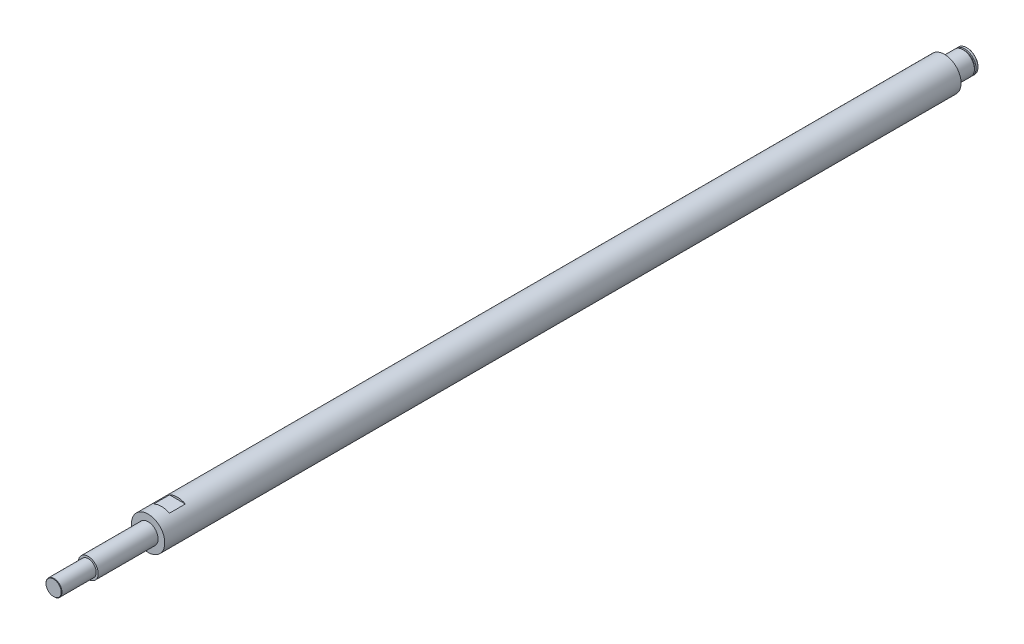
ISO-10303-21;
HEADER;
FILE_DESCRIPTION(('STEP AP214'),'2;1');
FILE_NAME('part.step','',(''),(''),'','','');
FILE_SCHEMA(('AUTOMOTIVE_DESIGN { 1 0 10303 214 1 1 1 1 }'));
ENDSEC;
DATA;
#1=APPLICATION_CONTEXT('core data for automotive mechanical design processes');
#2=APPLICATION_PROTOCOL_DEFINITION('international standard','automotive_design',2000,#1);
#3=PRODUCT_CONTEXT('',#1,'mechanical');
#4=PRODUCT('Part','Part','',(#3));
#5=PRODUCT_RELATED_PRODUCT_CATEGORY('part','',(#4));
#6=PRODUCT_DEFINITION_FORMATION('','',#4);
#7=PRODUCT_DEFINITION_CONTEXT('part definition',#1,'design');
#8=PRODUCT_DEFINITION('design','',#6,#7);
#9=PRODUCT_DEFINITION_SHAPE('','',#8);
#10=(LENGTH_UNIT() NAMED_UNIT(*) SI_UNIT(.MILLI.,.METRE.));
#11=(NAMED_UNIT(*) PLANE_ANGLE_UNIT() SI_UNIT($,.RADIAN.));
#12=(NAMED_UNIT(*) SI_UNIT($,.STERADIAN.) SOLID_ANGLE_UNIT());
#13=UNCERTAINTY_MEASURE_WITH_UNIT(LENGTH_MEASURE(1.E-05),#10,'distance_accuracy_value','');
#14=(GEOMETRIC_REPRESENTATION_CONTEXT(3) GLOBAL_UNCERTAINTY_ASSIGNED_CONTEXT((#13)) GLOBAL_UNIT_ASSIGNED_CONTEXT((#10,
#11,#12)) REPRESENTATION_CONTEXT('',''));
#15=CARTESIAN_POINT('',(0.,0.,0.));
#16=DIRECTION('',(0.,0.,1.));
#17=DIRECTION('',(1.,0.,0.));
#18=AXIS2_PLACEMENT_3D('',#15,#16,#17);
#19=CARTESIAN_POINT('',(0.,0.,0.));
#20=DIRECTION('',(0.,0.,1.));
#21=DIRECTION('',(1.,0.,0.));
#22=AXIS2_PLACEMENT_3D('',#19,#20,#21);
#23=PLANE('',#22);
#24=CARTESIAN_POINT('',(0.,0.,0.));
#25=DIRECTION('',(0.,0.,1.));
#26=DIRECTION('',(1.,0.,0.));
#27=AXIS2_PLACEMENT_3D('',#24,#25,#26);
#28=CIRCLE('',#27,8.19999999999993);
#29=CARTESIAN_POINT('',(8.19999999999993,0.,0.));
#30=VERTEX_POINT('',#29);
#31=EDGE_CURVE('E20',#30,#30,#28,.T.);
#32=ORIENTED_EDGE('',*,*,#31,.F.);
#33=EDGE_LOOP('',(#32));
#34=FACE_BOUND('',#33,.T.);
#35=ADVANCED_FACE('F17',(#34),#23,.F.);
#36=CARTESIAN_POINT('',(0.,0.,0.300000000000042));
#37=DIRECTION('',(0.,0.,1.));
#38=DIRECTION('',(1.,0.,0.));
#39=AXIS2_PLACEMENT_3D('',#36,#37,#38);
#40=CONICAL_SURFACE('',#39,8.5,0.785398163397497);
#41=CARTESIAN_POINT('',(0.,0.,0.300000000000042));
#42=DIRECTION('',(0.,0.,-1.));
#43=DIRECTION('',(-1.,0.,0.));
#44=AXIS2_PLACEMENT_3D('',#41,#42,#43);
#45=CIRCLE('',#44,8.5);
#46=CARTESIAN_POINT('',(-8.5,0.,0.300000000000042));
#47=VERTEX_POINT('',#46);
#48=EDGE_CURVE('E105',#47,#47,#45,.F.);
#49=ORIENTED_EDGE('',*,*,#48,.F.);
#50=EDGE_LOOP('',(#49));
#51=FACE_BOUND('',#50,.T.);
#52=ORIENTED_EDGE('',*,*,#31,.T.);
#53=EDGE_LOOP('',(#52));
#54=FACE_BOUND('',#53,.T.);
#55=ADVANCED_FACE('F313',(#51,#54),#40,.T.);
#56=CARTESIAN_POINT('',(0.,0.,686.));
#57=DIRECTION('',(0.,0.,1.));
#58=DIRECTION('',(1.,0.,0.));
#59=AXIS2_PLACEMENT_3D('',#56,#57,#58);
#60=PLANE('',#59);
#61=CARTESIAN_POINT('',(0.,0.,685.999999999979));
#62=DIRECTION('',(0.,0.,-1.));
#63=DIRECTION('',(-1.,0.,0.));
#64=AXIS2_PLACEMENT_3D('',#61,#62,#63);
#65=CIRCLE('',#64,5.69999999999027);
#66=CARTESIAN_POINT('',(-5.69999999999027,0.,685.999999999979));
#67=VERTEX_POINT('',#66);
#68=EDGE_CURVE('E103',#67,#67,#65,.T.);
#69=ORIENTED_EDGE('',*,*,#68,.F.);
#70=EDGE_LOOP('',(#69));
#71=FACE_BOUND('',#70,.T.);
#72=ADVANCED_FACE('F305',(#71),#60,.T.);
#73=CARTESIAN_POINT('',(0.,0.,1.8));
#74=DIRECTION('',(0.,0.,-1.));
#75=DIRECTION('',(-1.,0.,0.));
#76=AXIS2_PLACEMENT_3D('',#73,#74,#75);
#77=CYLINDRICAL_SURFACE('',#76,8.5);
#78=ORIENTED_EDGE('',*,*,#48,.T.);
#79=EDGE_LOOP('',(#78));
#80=FACE_BOUND('',#79,.T.);
#81=CARTESIAN_POINT('',(0.,0.,1.8));
#82=DIRECTION('',(0.,0.,-1.));
#83=DIRECTION('',(-1.,0.,0.));
#84=AXIS2_PLACEMENT_3D('',#81,#82,#83);
#85=CIRCLE('',#84,8.5);
#86=CARTESIAN_POINT('',(-8.5,0.,1.8));
#87=VERTEX_POINT('',#86);
#88=EDGE_CURVE('E101',#87,#87,#85,.F.);
#89=ORIENTED_EDGE('',*,*,#88,.F.);
#90=EDGE_LOOP('',(#89));
#91=FACE_BOUND('',#90,.T.);
#92=ADVANCED_FACE('F296',(#80,#91),#77,.T.);
#93=CARTESIAN_POINT('',(0.,0.,685.700000000111));
#94=DIRECTION('',(0.,0.,-1.));
#95=DIRECTION('',(-1.,0.,0.));
#96=AXIS2_PLACEMENT_3D('',#93,#94,#95);
#97=CONICAL_SURFACE('',#96,5.99999999985812,0.785398163397448);
#98=CARTESIAN_POINT('',(0.,0.,685.7));
#99=DIRECTION('',(0.,0.,-1.));
#100=DIRECTION('',(-1.,0.,0.));
#101=AXIS2_PLACEMENT_3D('',#98,#99,#100);
#102=CIRCLE('',#101,6.);
#103=CARTESIAN_POINT('',(-6.,0.,685.7));
#104=VERTEX_POINT('',#103);
#105=EDGE_CURVE('E100',#104,#104,#102,.T.);
#106=ORIENTED_EDGE('',*,*,#105,.F.);
#107=EDGE_LOOP('',(#106));
#108=FACE_BOUND('',#107,.T.);
#109=ORIENTED_EDGE('',*,*,#68,.T.);
#110=EDGE_LOOP('',(#109));
#111=FACE_BOUND('',#110,.T.);
#112=ADVANCED_FACE('F287',(#108,#111),#97,.T.);
#113=CARTESIAN_POINT('',(0.,0.,1.8));
#114=DIRECTION('',(0.,0.,1.));
#115=DIRECTION('',(1.,0.,0.));
#116=AXIS2_PLACEMENT_3D('',#113,#114,#115);
#117=PLANE('',#116);
#118=CARTESIAN_POINT('',(0.,0.,1.8));
#119=DIRECTION('',(0.,0.,-1.));
#120=DIRECTION('',(-1.,0.,0.));
#121=AXIS2_PLACEMENT_3D('',#118,#119,#120);
#122=CIRCLE('',#121,7.3);
#123=CARTESIAN_POINT('',(-7.3,0.,1.8));
#124=VERTEX_POINT('',#123);
#125=EDGE_CURVE('E97',#124,#124,#122,.F.);
#126=ORIENTED_EDGE('',*,*,#125,.F.);
#127=EDGE_LOOP('',(#126));
#128=FACE_BOUND('',#127,.T.);
#129=ORIENTED_EDGE('',*,*,#88,.T.);
#130=EDGE_LOOP('',(#129));
#131=FACE_BOUND('',#130,.T.);
#132=ADVANCED_FACE('F278',(#128,#131),#117,.T.);
#133=CARTESIAN_POINT('',(0.,0.,686.));
#134=DIRECTION('',(0.,0.,-1.));
#135=DIRECTION('',(-1.,0.,0.));
#136=AXIS2_PLACEMENT_3D('',#133,#134,#135);
#137=CYLINDRICAL_SURFACE('',#136,6.);
#138=CARTESIAN_POINT('',(0.,0.,660.));
#139=DIRECTION('',(0.,0.,-1.));
#140=DIRECTION('',(-1.,0.,0.));
#141=AXIS2_PLACEMENT_3D('',#138,#139,#140);
#142=CIRCLE('',#141,6.);
#143=CARTESIAN_POINT('',(-6.,0.,660.));
#144=VERTEX_POINT('',#143);
#145=EDGE_CURVE('E94',#144,#144,#142,.T.);
#146=ORIENTED_EDGE('',*,*,#145,.F.);
#147=EDGE_LOOP('',(#146));
#148=FACE_BOUND('',#147,.T.);
#149=ORIENTED_EDGE('',*,*,#105,.T.);
#150=EDGE_LOOP('',(#149));
#151=FACE_BOUND('',#150,.T.);
#152=ADVANCED_FACE('F269',(#148,#151),#137,.T.);
#153=CARTESIAN_POINT('',(0.,0.,3.));
#154=DIRECTION('',(0.,0.,-1.));
#155=DIRECTION('',(-1.,0.,0.));
#156=AXIS2_PLACEMENT_3D('',#153,#154,#155);
#157=CYLINDRICAL_SURFACE('',#156,7.3);
#158=CARTESIAN_POINT('',(0.,0.,3.));
#159=DIRECTION('',(0.,0.,-1.));
#160=DIRECTION('',(-1.,0.,0.));
#161=AXIS2_PLACEMENT_3D('',#158,#159,#160);
#162=CIRCLE('',#161,7.3);
#163=CARTESIAN_POINT('',(-7.3,0.,3.));
#164=VERTEX_POINT('',#163);
#165=EDGE_CURVE('E91',#164,#164,#162,.T.);
#166=ORIENTED_EDGE('',*,*,#165,.T.);
#167=EDGE_LOOP('',(#166));
#168=FACE_BOUND('',#167,.T.);
#169=ORIENTED_EDGE('',*,*,#125,.T.);
#170=EDGE_LOOP('',(#169));
#171=FACE_BOUND('',#170,.T.);
#172=ADVANCED_FACE('F260',(#168,#171),#157,.T.);
#173=CARTESIAN_POINT('',(0.,0.,660.));
#174=DIRECTION('',(0.,0.,1.));
#175=DIRECTION('',(1.,0.,0.));
#176=AXIS2_PLACEMENT_3D('',#173,#174,#175);
#177=PLANE('',#176);
#178=ORIENTED_EDGE('',*,*,#145,.T.);
#179=EDGE_LOOP('',(#178));
#180=FACE_BOUND('',#179,.T.);
#181=CARTESIAN_POINT('',(0.,0.,660.));
#182=DIRECTION('',(0.,0.,-1.));
#183=DIRECTION('',(-1.,0.,0.));
#184=AXIS2_PLACEMENT_3D('',#181,#182,#183);
#185=CIRCLE('',#184,7.5);
#186=CARTESIAN_POINT('',(-7.5,0.,660.));
#187=VERTEX_POINT('',#186);
#188=EDGE_CURVE('E88',#187,#187,#185,.T.);
#189=ORIENTED_EDGE('',*,*,#188,.F.);
#190=EDGE_LOOP('',(#189));
#191=FACE_BOUND('',#190,.T.);
#192=ADVANCED_FACE('F251',(#180,#191),#177,.T.);
#193=CARTESIAN_POINT('',(0.,0.,3.));
#194=DIRECTION('',(0.,0.,1.));
#195=DIRECTION('',(1.,0.,0.));
#196=AXIS2_PLACEMENT_3D('',#193,#194,#195);
#197=PLANE('',#196);
#198=ORIENTED_EDGE('',*,*,#165,.F.);
#199=EDGE_LOOP('',(#198));
#200=FACE_BOUND('',#199,.T.);
#201=CARTESIAN_POINT('',(0.,0.,3.));
#202=DIRECTION('',(0.,0.,-1.));
#203=DIRECTION('',(-1.,0.,0.));
#204=AXIS2_PLACEMENT_3D('',#201,#202,#203);
#205=CIRCLE('',#204,8.5);
#206=CARTESIAN_POINT('',(-8.5,0.,3.));
#207=VERTEX_POINT('',#206);
#208=EDGE_CURVE('E85',#207,#207,#205,.F.);
#209=ORIENTED_EDGE('',*,*,#208,.F.);
#210=EDGE_LOOP('',(#209));
#211=FACE_BOUND('',#210,.T.);
#212=ADVANCED_FACE('F242',(#200,#211),#197,.F.);
#213=CARTESIAN_POINT('',(0.,0.,660.));
#214=DIRECTION('',(0.,0.,-1.));
#215=DIRECTION('',(-1.,0.,0.));
#216=AXIS2_PLACEMENT_3D('',#213,#214,#215);
#217=CYLINDRICAL_SURFACE('',#216,7.5);
#218=CARTESIAN_POINT('',(0.,0.,615.));
#219=DIRECTION('',(0.,0.,-1.));
#220=DIRECTION('',(-1.,0.,0.));
#221=AXIS2_PLACEMENT_3D('',#218,#219,#220);
#222=CIRCLE('',#221,7.5);
#223=CARTESIAN_POINT('',(-7.5,0.,615.));
#224=VERTEX_POINT('',#223);
#225=EDGE_CURVE('E77',#224,#224,#222,.T.);
#226=ORIENTED_EDGE('',*,*,#225,.F.);
#227=EDGE_LOOP('',(#226));
#228=FACE_BOUND('',#227,.T.);
#229=ORIENTED_EDGE('',*,*,#188,.T.);
#230=EDGE_LOOP('',(#229));
#231=FACE_BOUND('',#230,.T.);
#232=ADVANCED_FACE('F233',(#228,#231),#217,.T.);
#233=CARTESIAN_POINT('',(0.,0.,17.));
#234=DIRECTION('',(0.,0.,-1.));
#235=DIRECTION('',(-1.,0.,0.));
#236=AXIS2_PLACEMENT_3D('',#233,#234,#235);
#237=CYLINDRICAL_SURFACE('',#236,8.5);
#238=CARTESIAN_POINT('',(0.,0.,17.));
#239=DIRECTION('',(0.,0.,-1.));
#240=DIRECTION('',(-1.,0.,0.));
#241=AXIS2_PLACEMENT_3D('',#238,#239,#240);
#242=CIRCLE('',#241,8.5);
#243=CARTESIAN_POINT('',(-8.5,0.,17.));
#244=VERTEX_POINT('',#243);
#245=EDGE_CURVE('E74',#244,#244,#242,.T.);
#246=ORIENTED_EDGE('',*,*,#245,.T.);
#247=EDGE_LOOP('',(#246));
#248=FACE_BOUND('',#247,.T.);
#249=ORIENTED_EDGE('',*,*,#208,.T.);
#250=EDGE_LOOP('',(#249));
#251=FACE_BOUND('',#250,.T.);
#252=ADVANCED_FACE('F141',(#248,#251),#237,.T.);
#253=CARTESIAN_POINT('',(-20.,-23.,605.));
#254=DIRECTION('',(0.,0.,1.));
#255=DIRECTION('',(1.,0.,0.));
#256=AXIS2_PLACEMENT_3D('',#253,#254,#255);
#257=PLANE('',#256);
#258=CARTESIAN_POINT('',(0.,0.,605.));
#259=DIRECTION('',(0.,0.,-1.));
#260=DIRECTION('',(-1.,0.,0.));
#261=AXIS2_PLACEMENT_3D('',#258,#259,#260);
#262=CIRCLE('',#261,12.5);
#263=CARTESIAN_POINT('',(-5.93717104351896,-11.,605.));
#264=VERTEX_POINT('',#263);
#265=CARTESIAN_POINT('',(5.93717104351896,-11.,605.));
#266=VERTEX_POINT('',#265);
#267=EDGE_CURVE('E54',#264,#266,#262,.F.);
#268=ORIENTED_EDGE('',*,*,#267,.F.);
#269=DIRECTION('',(1.,0.,0.));
#270=VECTOR('',#269,1.);
#271=CARTESIAN_POINT('',(0.,-11.,605.));
#272=LINE('',#271,#270);
#273=EDGE_CURVE('E56',#264,#266,#272,.T.);
#274=ORIENTED_EDGE('',*,*,#273,.T.);
#275=EDGE_LOOP('',(#268,#274));
#276=FACE_BOUND('',#275,.T.);
#277=ADVANCED_FACE('F58',(#276),#257,.F.);
#278=CARTESIAN_POINT('',(-20.,-23.,593.));
#279=DIRECTION('',(0.,0.,-1.));
#280=DIRECTION('',(-1.,0.,0.));
#281=AXIS2_PLACEMENT_3D('',#278,#279,#280);
#282=PLANE('',#281);
#283=CARTESIAN_POINT('',(0.,0.,593.));
#284=DIRECTION('',(0.,0.,-1.));
#285=DIRECTION('',(-1.,0.,0.));
#286=AXIS2_PLACEMENT_3D('',#283,#284,#285);
#287=CIRCLE('',#286,12.5);
#288=CARTESIAN_POINT('',(5.93717104351896,-11.,593.));
#289=VERTEX_POINT('',#288);
#290=CARTESIAN_POINT('',(-5.93717104351896,-11.,593.));
#291=VERTEX_POINT('',#290);
#292=EDGE_CURVE('E70',#289,#291,#287,.T.);
#293=ORIENTED_EDGE('',*,*,#292,.F.);
#294=DIRECTION('',(1.,0.,0.));
#295=VECTOR('',#294,1.);
#296=CARTESIAN_POINT('',(0.,-11.,593.));
#297=LINE('',#296,#295);
#298=EDGE_CURVE('E62',#289,#291,#297,.F.);
#299=ORIENTED_EDGE('',*,*,#298,.T.);
#300=EDGE_LOOP('',(#293,#299));
#301=FACE_BOUND('',#300,.T.);
#302=ADVANCED_FACE('F131',(#301),#282,.F.);
#303=CARTESIAN_POINT('',(0.,-11.,0.));
#304=DIRECTION('',(0.,1.,0.));
#305=DIRECTION('',(0.,0.,1.));
#306=AXIS2_PLACEMENT_3D('',#303,#304,#305);
#307=PLANE('',#306);
#308=DIRECTION('',(0.,0.,-1.));
#309=VECTOR('',#308,1.);
#310=CARTESIAN_POINT('',(-5.93717104351896,-11.,615.));
#311=LINE('',#310,#309);
#312=EDGE_CURVE('E73',#291,#264,#311,.F.);
#313=ORIENTED_EDGE('',*,*,#312,.F.);
#314=ORIENTED_EDGE('',*,*,#298,.F.);
#315=DIRECTION('',(0.,0.,-1.));
#316=VECTOR('',#315,1.);
#317=CARTESIAN_POINT('',(5.93717104351896,-11.,615.));
#318=LINE('',#317,#316);
#319=EDGE_CURVE('E65',#266,#289,#318,.T.);
#320=ORIENTED_EDGE('',*,*,#319,.F.);
#321=ORIENTED_EDGE('',*,*,#273,.F.);
#322=EDGE_LOOP('',(#313,#314,#320,#321));
#323=FACE_BOUND('',#322,.T.);
#324=ADVANCED_FACE('F66',(#323),#307,.F.);
#325=CARTESIAN_POINT('',(-20.,23.,605.));
#326=DIRECTION('',(0.,0.,-1.));
#327=DIRECTION('',(-1.,0.,0.));
#328=AXIS2_PLACEMENT_3D('',#325,#326,#327);
#329=PLANE('',#328);
#330=CARTESIAN_POINT('',(0.,0.,605.));
#331=DIRECTION('',(0.,0.,-1.));
#332=DIRECTION('',(-1.,0.,0.));
#333=AXIS2_PLACEMENT_3D('',#330,#331,#332);
#334=CIRCLE('',#333,12.5);
#335=CARTESIAN_POINT('',(5.93717104351896,11.,605.));
#336=VERTEX_POINT('',#335);
#337=CARTESIAN_POINT('',(-5.93717104351896,11.,605.));
#338=VERTEX_POINT('',#337);
#339=EDGE_CURVE('E121',#336,#338,#334,.F.);
#340=ORIENTED_EDGE('',*,*,#339,.F.);
#341=DIRECTION('',(1.,0.,0.));
#342=VECTOR('',#341,1.);
#343=CARTESIAN_POINT('',(0.,11.,605.));
#344=LINE('',#343,#342);
#345=EDGE_CURVE('E84',#336,#338,#344,.F.);
#346=ORIENTED_EDGE('',*,*,#345,.T.);
#347=EDGE_LOOP('',(#340,#346));
#348=FACE_BOUND('',#347,.T.);
#349=ADVANCED_FACE('F139',(#348),#329,.T.);
#350=CARTESIAN_POINT('',(-20.,23.,593.));
#351=DIRECTION('',(0.,0.,1.));
#352=DIRECTION('',(1.,0.,0.));
#353=AXIS2_PLACEMENT_3D('',#350,#351,#352);
#354=PLANE('',#353);
#355=CARTESIAN_POINT('',(0.,0.,593.));
#356=DIRECTION('',(0.,0.,-1.));
#357=DIRECTION('',(-1.,0.,0.));
#358=AXIS2_PLACEMENT_3D('',#355,#356,#357);
#359=CIRCLE('',#358,12.5);
#360=CARTESIAN_POINT('',(-5.93717104351896,11.,593.));
#361=VERTEX_POINT('',#360);
#362=CARTESIAN_POINT('',(5.93717104351896,11.,593.));
#363=VERTEX_POINT('',#362);
#364=EDGE_CURVE('E118',#361,#363,#359,.T.);
#365=ORIENTED_EDGE('',*,*,#364,.F.);
#366=DIRECTION('',(1.,0.,0.));
#367=VECTOR('',#366,1.);
#368=CARTESIAN_POINT('',(0.,11.,593.));
#369=LINE('',#368,#367);
#370=EDGE_CURVE('E34',#361,#363,#369,.T.);
#371=ORIENTED_EDGE('',*,*,#370,.T.);
#372=EDGE_LOOP('',(#365,#371));
#373=FACE_BOUND('',#372,.T.);
#374=ADVANCED_FACE('F161',(#373),#354,.T.);
#375=CARTESIAN_POINT('',(0.,11.,0.));
#376=DIRECTION('',(0.,-1.,0.));
#377=DIRECTION('',(0.,0.,-1.));
#378=AXIS2_PLACEMENT_3D('',#375,#376,#377);
#379=PLANE('',#378);
#380=DIRECTION('',(0.,0.,-1.));
#381=VECTOR('',#380,1.);
#382=CARTESIAN_POINT('',(5.93717104351897,11.,615.));
#383=LINE('',#382,#381);
#384=EDGE_CURVE('E117',#363,#336,#383,.F.);
#385=ORIENTED_EDGE('',*,*,#384,.F.);
#386=ORIENTED_EDGE('',*,*,#370,.F.);
#387=DIRECTION('',(0.,0.,-1.));
#388=VECTOR('',#387,1.);
#389=CARTESIAN_POINT('',(-5.93717104351896,11.,615.));
#390=LINE('',#389,#388);
#391=EDGE_CURVE('E120',#338,#361,#390,.T.);
#392=ORIENTED_EDGE('',*,*,#391,.F.);
#393=ORIENTED_EDGE('',*,*,#345,.F.);
#394=EDGE_LOOP('',(#385,#386,#392,#393));
#395=FACE_BOUND('',#394,.T.);
#396=ADVANCED_FACE('F157',(#395),#379,.F.);
#397=CARTESIAN_POINT('',(0.,0.,615.));
#398=DIRECTION('',(0.,0.,1.));
#399=DIRECTION('',(1.,0.,0.));
#400=AXIS2_PLACEMENT_3D('',#397,#398,#399);
#401=PLANE('',#400);
#402=ORIENTED_EDGE('',*,*,#225,.T.);
#403=EDGE_LOOP('',(#402));
#404=FACE_BOUND('',#403,.T.);
#405=CARTESIAN_POINT('',(0.,0.,615.));
#406=DIRECTION('',(0.,0.,-1.));
#407=DIRECTION('',(-1.,0.,0.));
#408=AXIS2_PLACEMENT_3D('',#405,#406,#407);
#409=CIRCLE('',#408,12.5);
#410=CARTESIAN_POINT('',(-12.5,0.,615.));
#411=VERTEX_POINT('',#410);
#412=EDGE_CURVE('E26',#411,#411,#409,.T.);
#413=ORIENTED_EDGE('',*,*,#412,.F.);
#414=EDGE_LOOP('',(#413));
#415=FACE_BOUND('',#414,.T.);
#416=ADVANCED_FACE('F150',(#404,#415),#401,.T.);
#417=CARTESIAN_POINT('',(0.,0.,17.));
#418=DIRECTION('',(0.,0.,1.));
#419=DIRECTION('',(1.,0.,0.));
#420=AXIS2_PLACEMENT_3D('',#417,#418,#419);
#421=PLANE('',#420);
#422=ORIENTED_EDGE('',*,*,#245,.F.);
#423=EDGE_LOOP('',(#422));
#424=FACE_BOUND('',#423,.T.);
#425=CARTESIAN_POINT('',(0.,0.,17.));
#426=DIRECTION('',(0.,0.,-1.));
#427=DIRECTION('',(-1.,0.,0.));
#428=AXIS2_PLACEMENT_3D('',#425,#426,#427);
#429=CIRCLE('',#428,12.5);
#430=CARTESIAN_POINT('',(-12.5,0.,17.));
#431=VERTEX_POINT('',#430);
#432=EDGE_CURVE('E11',#431,#431,#429,.F.);
#433=ORIENTED_EDGE('',*,*,#432,.F.);
#434=EDGE_LOOP('',(#433));
#435=FACE_BOUND('',#434,.T.);
#436=ADVANCED_FACE('F144',(#424,#435),#421,.F.);
#437=CARTESIAN_POINT('',(0.,0.,615.));
#438=DIRECTION('',(0.,0.,-1.));
#439=DIRECTION('',(-1.,0.,0.));
#440=AXIS2_PLACEMENT_3D('',#437,#438,#439);
#441=CYLINDRICAL_SURFACE('',#440,12.5);
#442=ORIENTED_EDGE('',*,*,#432,.T.);
#443=EDGE_LOOP('',(#442));
#444=FACE_BOUND('',#443,.T.);
#445=ORIENTED_EDGE('',*,*,#412,.T.);
#446=EDGE_LOOP('',(#445));
#447=FACE_BOUND('',#446,.T.);
#448=ORIENTED_EDGE('',*,*,#364,.T.);
#449=ORIENTED_EDGE('',*,*,#384,.T.);
#450=ORIENTED_EDGE('',*,*,#339,.T.);
#451=ORIENTED_EDGE('',*,*,#391,.T.);
#452=EDGE_LOOP('',(#448,#449,#450,#451));
#453=FACE_BOUND('',#452,.T.);
#454=ORIENTED_EDGE('',*,*,#292,.T.);
#455=ORIENTED_EDGE('',*,*,#312,.T.);
#456=ORIENTED_EDGE('',*,*,#267,.T.);
#457=ORIENTED_EDGE('',*,*,#319,.T.);
#458=EDGE_LOOP('',(#454,#455,#456,#457));
#459=FACE_BOUND('',#458,.T.);
#460=ADVANCED_FACE('F72',(#444,#447,#453,#459),#441,.T.);
#461=CLOSED_SHELL('',(#35,#55,#72,#92,#112,#132,#152,#172,#192,#212,#232,#252,#277,#302,#324,
#349,#374,#396,#416,#436,#460));
#462=MANIFOLD_SOLID_BREP('B1',#461);
#463=ADVANCED_BREP_SHAPE_REPRESENTATION('',(#18,#462),#14);
#464=SHAPE_DEFINITION_REPRESENTATION(#9,#463);
ENDSEC;
END-ISO-10303-21;
